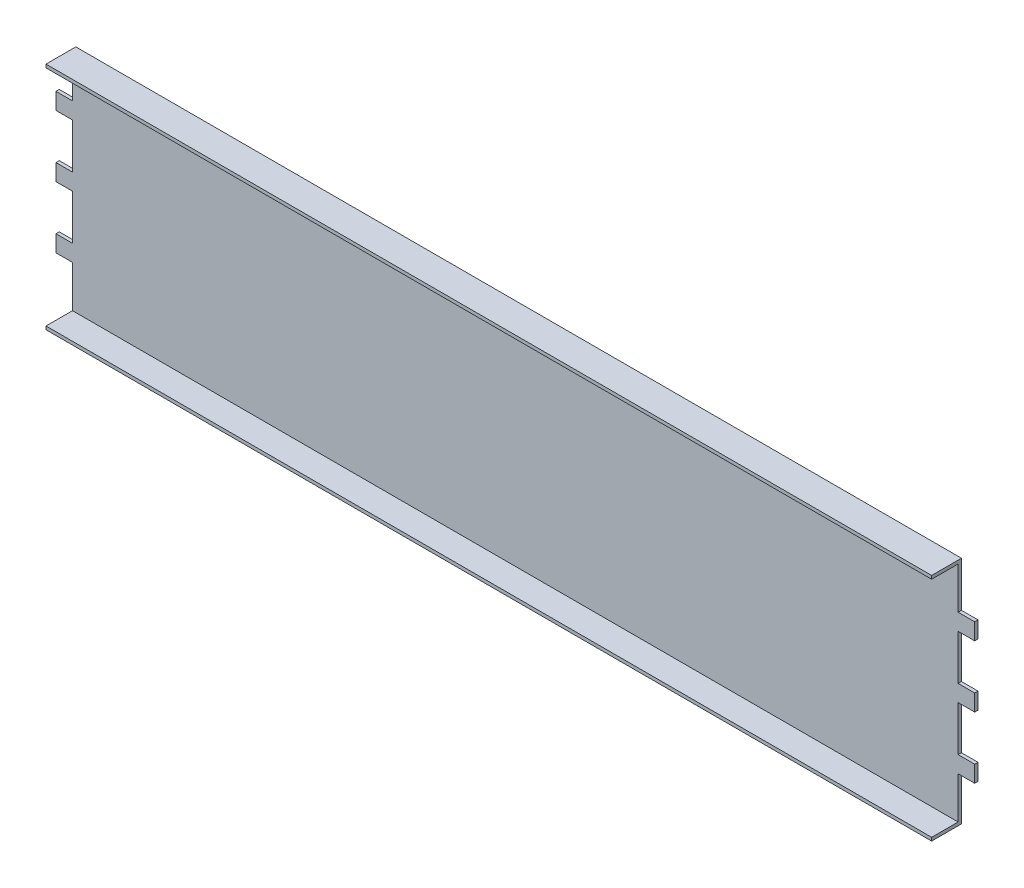
ISO-10303-21;
HEADER;
FILE_DESCRIPTION(('STEP AP214'),'2;1');
FILE_NAME('part.step','',(''),(''),'','','');
FILE_SCHEMA(('AUTOMOTIVE_DESIGN { 1 0 10303 214 1 1 1 1 }'));
ENDSEC;
DATA;
#1=APPLICATION_CONTEXT('core data for automotive mechanical design processes');
#2=APPLICATION_PROTOCOL_DEFINITION('international standard','automotive_design',2000,#1);
#3=PRODUCT_CONTEXT('',#1,'mechanical');
#4=PRODUCT('Part','Part','',(#3));
#5=PRODUCT_RELATED_PRODUCT_CATEGORY('part','',(#4));
#6=PRODUCT_DEFINITION_FORMATION('','',#4);
#7=PRODUCT_DEFINITION_CONTEXT('part definition',#1,'design');
#8=PRODUCT_DEFINITION('design','',#6,#7);
#9=PRODUCT_DEFINITION_SHAPE('','',#8);
#10=(LENGTH_UNIT() NAMED_UNIT(*) SI_UNIT(.MILLI.,.METRE.));
#11=(NAMED_UNIT(*) PLANE_ANGLE_UNIT() SI_UNIT($,.RADIAN.));
#12=(NAMED_UNIT(*) SI_UNIT($,.STERADIAN.) SOLID_ANGLE_UNIT());
#13=UNCERTAINTY_MEASURE_WITH_UNIT(LENGTH_MEASURE(1.E-05),#10,'distance_accuracy_value','');
#14=(GEOMETRIC_REPRESENTATION_CONTEXT(3) GLOBAL_UNCERTAINTY_ASSIGNED_CONTEXT((#13)) GLOBAL_UNIT_ASSIGNED_CONTEXT((#10,
#11,#12)) REPRESENTATION_CONTEXT('',''));
#15=CARTESIAN_POINT('',(0.,0.,0.));
#16=DIRECTION('',(0.,0.,1.));
#17=DIRECTION('',(1.,0.,0.));
#18=AXIS2_PLACEMENT_3D('',#15,#16,#17);
#19=CARTESIAN_POINT('',(90.5,81.5000000000001,0.));
#20=DIRECTION('',(1.,0.,0.));
#21=DIRECTION('',(0.,1.,0.));
#22=AXIS2_PLACEMENT_3D('',#19,#20,#21);
#23=PLANE('',#22);
#24=DIRECTION('',(0.,-1.,0.));
#25=VECTOR('',#24,1.);
#26=CARTESIAN_POINT('',(90.4999999999999,-1.02295014862437E-13,-8.00000000000001));
#27=LINE('',#26,#25);
#28=CARTESIAN_POINT('',(90.5000000000009,914.375000000002,-8.00000000000001));
#29=VERTEX_POINT('',#28);
#30=CARTESIAN_POINT('',(90.5000000000009,900.750000000002,-7.99999999999981));
#31=VERTEX_POINT('',#30);
#32=EDGE_CURVE('E426',#29,#31,#27,.T.);
#33=ORIENTED_EDGE('',*,*,#32,.F.);
#34=DIRECTION('',(0.,0.,-1.));
#35=VECTOR('',#34,1.);
#36=CARTESIAN_POINT('',(90.5000000000009,914.375000000002,-7.99999999999981));
#37=LINE('',#36,#35);
#38=CARTESIAN_POINT('',(90.5000000000009,914.375000000002,-9.00000000000001));
#39=VERTEX_POINT('',#38);
#40=EDGE_CURVE('E245',#29,#39,#37,.T.);
#41=ORIENTED_EDGE('',*,*,#40,.T.);
#42=DIRECTION('',(0.,-1.,0.));
#43=VECTOR('',#42,1.);
#44=CARTESIAN_POINT('',(90.4999999999999,-1.02295014862437E-13,-9.00000000000001));
#45=LINE('',#44,#43);
#46=CARTESIAN_POINT('',(90.5000000000009,900.750000000002,-9.00000000000001));
#47=VERTEX_POINT('',#46);
#48=EDGE_CURVE('E456',#39,#47,#45,.T.);
#49=ORIENTED_EDGE('',*,*,#48,.T.);
#50=DIRECTION('',(0.,0.,-1.));
#51=VECTOR('',#50,1.);
#52=CARTESIAN_POINT('',(90.5000000000009,900.750000000002,-7.99999999999981));
#53=LINE('',#52,#51);
#54=EDGE_CURVE('E281',#31,#47,#53,.T.);
#55=ORIENTED_EDGE('',*,*,#54,.F.);
#56=EDGE_LOOP('',(#33,#41,#49,#55));
#57=FACE_BOUND('',#56,.T.);
#58=ADVANCED_FACE('F16',(#57),#23,.F.);
#59=CARTESIAN_POINT('',(90.5000000000009,895.750000000002,-8.00000000000001));
#60=VERTEX_POINT('',#59);
#61=CARTESIAN_POINT('',(90.5000000000009,882.125000000002,-7.99999999999981));
#62=VERTEX_POINT('',#61);
#63=EDGE_CURVE('E507',#60,#62,#27,.T.);
#64=ORIENTED_EDGE('',*,*,#63,.F.);
#65=DIRECTION('',(0.,0.,-1.));
#66=VECTOR('',#65,1.);
#67=CARTESIAN_POINT('',(90.5000000000009,895.750000000002,-7.99999999999981));
#68=LINE('',#67,#66);
#69=CARTESIAN_POINT('',(90.5000000000009,895.750000000002,-9.00000000000001));
#70=VERTEX_POINT('',#69);
#71=EDGE_CURVE('E277',#60,#70,#68,.T.);
#72=ORIENTED_EDGE('',*,*,#71,.T.);
#73=CARTESIAN_POINT('',(90.5000000000009,882.125000000002,-9.00000000000001));
#74=VERTEX_POINT('',#73);
#75=EDGE_CURVE('E543',#70,#74,#45,.T.);
#76=ORIENTED_EDGE('',*,*,#75,.T.);
#77=DIRECTION('',(0.,0.,-1.));
#78=VECTOR('',#77,1.);
#79=CARTESIAN_POINT('',(90.5000000000009,882.125000000002,-7.99999999999981));
#80=LINE('',#79,#78);
#81=EDGE_CURVE('E309',#62,#74,#80,.T.);
#82=ORIENTED_EDGE('',*,*,#81,.F.);
#83=EDGE_LOOP('',(#64,#72,#76,#82));
#84=FACE_BOUND('',#83,.T.);
#85=ADVANCED_FACE('F547',(#84),#23,.F.);
#86=CARTESIAN_POINT('',(90.5000000000009,933.000000000002,-8.99999999999988));
#87=VERTEX_POINT('',#86);
#88=CARTESIAN_POINT('',(90.5000000000009,919.375000000002,-9.00000000000001));
#89=VERTEX_POINT('',#88);
#90=EDGE_CURVE('E436',#87,#89,#45,.T.);
#91=ORIENTED_EDGE('',*,*,#90,.T.);
#92=DIRECTION('',(0.,0.,-1.));
#93=VECTOR('',#92,1.);
#94=CARTESIAN_POINT('',(90.5000000000009,919.375000000002,-7.99999999999981));
#95=LINE('',#94,#93);
#96=CARTESIAN_POINT('',(90.5000000000009,919.375000000002,-7.99999999999981));
#97=VERTEX_POINT('',#96);
#98=EDGE_CURVE('E258',#97,#89,#95,.T.);
#99=ORIENTED_EDGE('',*,*,#98,.F.);
#100=CARTESIAN_POINT('',(90.5000000000009,932.000000000002,-7.99999999999981));
#101=VERTEX_POINT('',#100);
#102=EDGE_CURVE('E424',#101,#97,#27,.T.);
#103=ORIENTED_EDGE('',*,*,#102,.F.);
#104=DIRECTION('',(0.,0.,1.));
#105=VECTOR('',#104,1.);
#106=CARTESIAN_POINT('',(90.5000000000009,932.000000000002,-9.00000000000001));
#107=LINE('',#106,#105);
#108=CARTESIAN_POINT('',(90.5000000000009,932.000000000002,0.));
#109=VERTEX_POINT('',#108);
#110=EDGE_CURVE('E419',#101,#109,#107,.T.);
#111=ORIENTED_EDGE('',*,*,#110,.T.);
#112=DIRECTION('',(0.,-1.,0.));
#113=VECTOR('',#112,1.);
#114=CARTESIAN_POINT('',(90.5000000000009,863.500000000002,2.18575157973073E-13));
#115=LINE('',#114,#113);
#116=CARTESIAN_POINT('',(90.5000000000009,933.,0.));
#117=VERTEX_POINT('',#116);
#118=EDGE_CURVE('E430',#117,#109,#115,.T.);
#119=ORIENTED_EDGE('',*,*,#118,.F.);
#120=DIRECTION('',(0.,0.,1.));
#121=VECTOR('',#120,1.);
#122=CARTESIAN_POINT('',(90.5000000000009,933.000000000002,-9.00000000000001));
#123=LINE('',#122,#121);
#124=EDGE_CURVE('E396',#87,#117,#123,.T.);
#125=ORIENTED_EDGE('',*,*,#124,.F.);
#126=EDGE_LOOP('',(#91,#99,#103,#111,#119,#125));
#127=FACE_BOUND('',#126,.T.);
#128=ADVANCED_FACE('F498',(#127),#23,.F.);
#129=CARTESIAN_POINT('',(358.000000000002,863.500000000001,2.18575157973071E-13));
#130=DIRECTION('',(-1.,0.,0.));
#131=DIRECTION('',(0.,-1.,0.));
#132=AXIS2_PLACEMENT_3D('',#129,#130,#131);
#133=PLANE('',#132);
#134=DIRECTION('',(0.,1.,0.));
#135=VECTOR('',#134,1.);
#136=CARTESIAN_POINT('',(358.000000000003,4.17332834956603E-13,-8.00000000000001));
#137=LINE('',#136,#135);
#138=CARTESIAN_POINT('',(358.000000000001,882.125000000002,-8.00000000000001));
#139=VERTEX_POINT('',#138);
#140=CARTESIAN_POINT('',(358.000000000001,895.750000000002,-7.99999999999981));
#141=VERTEX_POINT('',#140);
#142=EDGE_CURVE('E422',#139,#141,#137,.T.);
#143=ORIENTED_EDGE('',*,*,#142,.F.);
#144=DIRECTION('',(0.,0.,-1.));
#145=VECTOR('',#144,1.);
#146=CARTESIAN_POINT('',(358.000000000001,882.125000000002,-7.99999999999981));
#147=LINE('',#146,#145);
#148=CARTESIAN_POINT('',(358.000000000001,882.125000000002,-9.00000000000001));
#149=VERTEX_POINT('',#148);
#150=EDGE_CURVE('E332',#139,#149,#147,.T.);
#151=ORIENTED_EDGE('',*,*,#150,.T.);
#152=DIRECTION('',(0.,1.,0.));
#153=VECTOR('',#152,1.);
#154=CARTESIAN_POINT('',(358.000000000003,4.17332834956603E-13,-9.00000000000001));
#155=LINE('',#154,#153);
#156=CARTESIAN_POINT('',(358.000000000001,895.750000000002,-9.00000000000001));
#157=VERTEX_POINT('',#156);
#158=EDGE_CURVE('E440',#149,#157,#155,.T.);
#159=ORIENTED_EDGE('',*,*,#158,.T.);
#160=DIRECTION('',(0.,0.,-1.));
#161=VECTOR('',#160,1.);
#162=CARTESIAN_POINT('',(358.000000000001,895.750000000002,-7.99999999999981));
#163=LINE('',#162,#161);
#164=EDGE_CURVE('E363',#141,#157,#163,.T.);
#165=ORIENTED_EDGE('',*,*,#164,.F.);
#166=EDGE_LOOP('',(#143,#151,#159,#165));
#167=FACE_BOUND('',#166,.T.);
#168=ADVANCED_FACE('F473',(#167),#133,.F.);
#169=CARTESIAN_POINT('',(358.000000000001,900.750000000002,-8.00000000000001));
#170=VERTEX_POINT('',#169);
#171=CARTESIAN_POINT('',(358.000000000001,914.375000000002,-7.99999999999981));
#172=VERTEX_POINT('',#171);
#173=EDGE_CURVE('E487',#170,#172,#137,.T.);
#174=ORIENTED_EDGE('',*,*,#173,.F.);
#175=DIRECTION('',(0.,0.,-1.));
#176=VECTOR('',#175,1.);
#177=CARTESIAN_POINT('',(358.000000000001,900.750000000002,-7.99999999999981));
#178=LINE('',#177,#176);
#179=CARTESIAN_POINT('',(358.000000000001,900.750000000002,-9.00000000000001));
#180=VERTEX_POINT('',#179);
#181=EDGE_CURVE('E359',#170,#180,#178,.T.);
#182=ORIENTED_EDGE('',*,*,#181,.T.);
#183=CARTESIAN_POINT('',(358.000000000001,914.375000000002,-9.00000000000001));
#184=VERTEX_POINT('',#183);
#185=EDGE_CURVE('E462',#180,#184,#155,.T.);
#186=ORIENTED_EDGE('',*,*,#185,.T.);
#187=DIRECTION('',(0.,0.,-1.));
#188=VECTOR('',#187,1.);
#189=CARTESIAN_POINT('',(358.000000000001,914.375000000002,-7.99999999999981));
#190=LINE('',#189,#188);
#191=EDGE_CURVE('E390',#172,#184,#190,.T.);
#192=ORIENTED_EDGE('',*,*,#191,.F.);
#193=EDGE_LOOP('',(#174,#182,#186,#192));
#194=FACE_BOUND('',#193,.T.);
#195=ADVANCED_FACE('F581',(#194),#133,.F.);
#196=CARTESIAN_POINT('',(358.000000000001,863.500000000002,-8.99999999999985));
#197=VERTEX_POINT('',#196);
#198=CARTESIAN_POINT('',(358.000000000001,877.125000000002,-9.00000000000001));
#199=VERTEX_POINT('',#198);
#200=EDGE_CURVE('E437',#197,#199,#155,.T.);
#201=ORIENTED_EDGE('',*,*,#200,.T.);
#202=DIRECTION('',(0.,0.,-1.));
#203=VECTOR('',#202,1.);
#204=CARTESIAN_POINT('',(358.000000000001,877.125000000002,-7.99999999999981));
#205=LINE('',#204,#203);
#206=CARTESIAN_POINT('',(358.000000000001,877.125000000002,-7.99999999999981));
#207=VERTEX_POINT('',#206);
#208=EDGE_CURVE('E336',#207,#199,#205,.T.);
#209=ORIENTED_EDGE('',*,*,#208,.F.);
#210=CARTESIAN_POINT('',(358.000000000002,864.5,-7.9999999999999));
#211=VERTEX_POINT('',#210);
#212=EDGE_CURVE('E399',#211,#207,#137,.T.);
#213=ORIENTED_EDGE('',*,*,#212,.F.);
#214=DIRECTION('',(0.,0.,-1.));
#215=VECTOR('',#214,1.);
#216=CARTESIAN_POINT('',(358.000000000002,864.5,-840.081223467358));
#217=LINE('',#216,#215);
#218=CARTESIAN_POINT('',(358.000000000002,864.5,0.));
#219=VERTEX_POINT('',#218);
#220=EDGE_CURVE('E402',#219,#211,#217,.T.);
#221=ORIENTED_EDGE('',*,*,#220,.F.);
#222=DIRECTION('',(0.,1.,0.));
#223=VECTOR('',#222,1.);
#224=CARTESIAN_POINT('',(358.000000000002,863.500000000001,2.18575157973071E-13));
#225=LINE('',#224,#223);
#226=CARTESIAN_POINT('',(358.000000000002,863.500000000001,2.18575157973071E-13));
#227=VERTEX_POINT('',#226);
#228=EDGE_CURVE('E432',#227,#219,#225,.T.);
#229=ORIENTED_EDGE('',*,*,#228,.F.);
#230=DIRECTION('',(0.,0.,1.));
#231=VECTOR('',#230,1.);
#232=CARTESIAN_POINT('',(358.000000000001,863.500000000002,-7.99999999999959));
#233=LINE('',#232,#231);
#234=EDGE_CURVE('E410',#197,#227,#233,.T.);
#235=ORIENTED_EDGE('',*,*,#234,.F.);
#236=EDGE_LOOP('',(#201,#209,#213,#221,#229,#235));
#237=FACE_BOUND('',#236,.T.);
#238=ADVANCED_FACE('F527',(#237),#133,.F.);
#239=CARTESIAN_POINT('',(90.5000000000009,877.125000000002,-7.99999999999981));
#240=VERTEX_POINT('',#239);
#241=CARTESIAN_POINT('',(90.5000000000009,864.500000000001,-7.9999999999999));
#242=VERTEX_POINT('',#241);
#243=EDGE_CURVE('E427',#240,#242,#27,.T.);
#244=ORIENTED_EDGE('',*,*,#243,.F.);
#245=DIRECTION('',(0.,0.,-1.));
#246=VECTOR('',#245,1.);
#247=CARTESIAN_POINT('',(90.5000000000009,877.125000000002,-7.99999999999981));
#248=LINE('',#247,#246);
#249=CARTESIAN_POINT('',(90.5000000000009,877.125000000002,-9.00000000000001));
#250=VERTEX_POINT('',#249);
#251=EDGE_CURVE('E305',#240,#250,#248,.T.);
#252=ORIENTED_EDGE('',*,*,#251,.T.);
#253=CARTESIAN_POINT('',(90.5000000000009,863.500000000002,-8.9999999999997));
#254=VERTEX_POINT('',#253);
#255=EDGE_CURVE('E439',#250,#254,#45,.T.);
#256=ORIENTED_EDGE('',*,*,#255,.T.);
#257=DIRECTION('',(0.,0.,1.));
#258=VECTOR('',#257,1.);
#259=CARTESIAN_POINT('',(90.5000000000014,863.500000000002,-7.99999999999962));
#260=LINE('',#259,#258);
#261=CARTESIAN_POINT('',(90.5,863.500000000002,0.));
#262=VERTEX_POINT('',#261);
#263=EDGE_CURVE('E20',#254,#262,#260,.T.);
#264=ORIENTED_EDGE('',*,*,#263,.T.);
#265=DIRECTION('',(0.,-1.,0.));
#266=VECTOR('',#265,1.);
#267=CARTESIAN_POINT('',(90.5000000000009,863.500000000002,2.18575157973073E-13));
#268=LINE('',#267,#266);
#269=CARTESIAN_POINT('',(90.5000000000009,864.5,0.));
#270=VERTEX_POINT('',#269);
#271=EDGE_CURVE('E434',#270,#262,#268,.T.);
#272=ORIENTED_EDGE('',*,*,#271,.F.);
#273=DIRECTION('',(0.,0.,1.));
#274=VECTOR('',#273,1.);
#275=CARTESIAN_POINT('',(90.5000000000009,864.500000000001,-840.081223467358));
#276=LINE('',#275,#274);
#277=EDGE_CURVE('E400',#242,#270,#276,.T.);
#278=ORIENTED_EDGE('',*,*,#277,.F.);
#279=EDGE_LOOP('',(#244,#252,#256,#264,#272,#278));
#280=FACE_BOUND('',#279,.T.);
#281=ADVANCED_FACE('F517',(#280),#23,.F.);
#282=CARTESIAN_POINT('',(358.000000000001,919.375000000002,-7.99999999999981));
#283=VERTEX_POINT('',#282);
#284=CARTESIAN_POINT('',(358.000000000001,932.000000000002,-7.99999999999981));
#285=VERTEX_POINT('',#284);
#286=EDGE_CURVE('E423',#283,#285,#137,.T.);
#287=ORIENTED_EDGE('',*,*,#286,.F.);
#288=DIRECTION('',(0.,0.,-1.));
#289=VECTOR('',#288,1.);
#290=CARTESIAN_POINT('',(358.000000000001,919.375000000002,-7.99999999999981));
#291=LINE('',#290,#289);
#292=CARTESIAN_POINT('',(358.000000000001,919.375000000002,-9.00000000000001));
#293=VERTEX_POINT('',#292);
#294=EDGE_CURVE('E387',#283,#293,#291,.T.);
#295=ORIENTED_EDGE('',*,*,#294,.T.);
#296=CARTESIAN_POINT('',(358.000000000001,933.000000000002,-8.99999999999988));
#297=VERTEX_POINT('',#296);
#298=EDGE_CURVE('E441',#293,#297,#155,.T.);
#299=ORIENTED_EDGE('',*,*,#298,.T.);
#300=DIRECTION('',(0.,0.,-1.));
#301=VECTOR('',#300,1.);
#302=CARTESIAN_POINT('',(358.000000000001,933.000000000002,-9.00000000000001));
#303=LINE('',#302,#301);
#304=CARTESIAN_POINT('',(358.000000000001,933.,0.));
#305=VERTEX_POINT('',#304);
#306=EDGE_CURVE('E398',#305,#297,#303,.T.);
#307=ORIENTED_EDGE('',*,*,#306,.F.);
#308=DIRECTION('',(0.,1.,0.));
#309=VECTOR('',#308,1.);
#310=CARTESIAN_POINT('',(358.000000000002,863.500000000001,2.18575157973071E-13));
#311=LINE('',#310,#309);
#312=CARTESIAN_POINT('',(358.000000000001,932.000000000002,0.));
#313=VERTEX_POINT('',#312);
#314=EDGE_CURVE('E428',#313,#305,#311,.T.);
#315=ORIENTED_EDGE('',*,*,#314,.F.);
#316=DIRECTION('',(0.,0.,-1.));
#317=VECTOR('',#316,1.);
#318=CARTESIAN_POINT('',(358.000000000001,932.000000000002,-9.00000000000001));
#319=LINE('',#318,#317);
#320=EDGE_CURVE('E416',#313,#285,#319,.T.);
#321=ORIENTED_EDGE('',*,*,#320,.T.);
#322=EDGE_LOOP('',(#287,#295,#299,#307,#315,#321));
#323=FACE_BOUND('',#322,.T.);
#324=ADVANCED_FACE('F494',(#323),#133,.F.);
#325=CARTESIAN_POINT('',(358.000000000002,863.500000000001,2.18575157973071E-13));
#326=DIRECTION('',(0.,0.,-1.));
#327=DIRECTION('',(0.,1.,0.));
#328=AXIS2_PLACEMENT_3D('',#325,#326,#327);
#329=PLANE('',#328);
#330=DIRECTION('',(1.,0.,0.));
#331=VECTOR('',#330,1.);
#332=CARTESIAN_POINT('',(0.,933.,0.));
#333=LINE('',#332,#331);
#334=EDGE_CURVE('E450',#305,#117,#333,.F.);
#335=ORIENTED_EDGE('',*,*,#334,.T.);
#336=ORIENTED_EDGE('',*,*,#118,.T.);
#337=DIRECTION('',(1.,0.,0.));
#338=VECTOR('',#337,1.);
#339=CARTESIAN_POINT('',(0.,932.000000000002,0.));
#340=LINE('',#339,#338);
#341=EDGE_CURVE('E447',#109,#313,#340,.T.);
#342=ORIENTED_EDGE('',*,*,#341,.T.);
#343=ORIENTED_EDGE('',*,*,#314,.T.);
#344=EDGE_LOOP('',(#335,#336,#342,#343));
#345=FACE_BOUND('',#344,.T.);
#346=ADVANCED_FACE('F580',(#345),#329,.F.);
#347=CARTESIAN_POINT('',(0.,0.,-9.00000000000001));
#348=DIRECTION('',(0.,0.,-1.));
#349=DIRECTION('',(0.,1.,0.));
#350=AXIS2_PLACEMENT_3D('',#347,#348,#349);
#351=PLANE('',#350);
#352=ORIENTED_EDGE('',*,*,#90,.F.);
#353=DIRECTION('',(1.,0.,0.));
#354=VECTOR('',#353,1.);
#355=CARTESIAN_POINT('',(437.500000000002,933.000000000002,-8.99999999999988));
#356=LINE('',#355,#354);
#357=EDGE_CURVE('E11',#87,#297,#356,.T.);
#358=ORIENTED_EDGE('',*,*,#357,.T.);
#359=ORIENTED_EDGE('',*,*,#298,.F.);
#360=DIRECTION('',(1.,0.,0.));
#361=VECTOR('',#360,1.);
#362=CARTESIAN_POINT('',(358.000000000001,919.375000000002,-9.00000000000001));
#363=LINE('',#362,#361);
#364=CARTESIAN_POINT('',(363.000000000001,919.375000000002,-9.00000000000001));
#365=VERTEX_POINT('',#364);
#366=EDGE_CURVE('E362',#293,#365,#363,.T.);
#367=ORIENTED_EDGE('',*,*,#366,.T.);
#368=DIRECTION('',(0.,-1.,0.));
#369=VECTOR('',#368,1.);
#370=CARTESIAN_POINT('',(363.000000000001,919.375000000002,-9.00000000000001));
#371=LINE('',#370,#369);
#372=CARTESIAN_POINT('',(363.000000000001,914.375000000002,-9.00000000000001));
#373=VERTEX_POINT('',#372);
#374=EDGE_CURVE('E382',#365,#373,#371,.T.);
#375=ORIENTED_EDGE('',*,*,#374,.T.);
#376=DIRECTION('',(-1.,0.,0.));
#377=VECTOR('',#376,1.);
#378=CARTESIAN_POINT('',(358.000000000001,914.375000000002,-9.00000000000001));
#379=LINE('',#378,#377);
#380=EDGE_CURVE('E373',#373,#184,#379,.T.);
#381=ORIENTED_EDGE('',*,*,#380,.T.);
#382=ORIENTED_EDGE('',*,*,#185,.F.);
#383=DIRECTION('',(1.,0.,0.));
#384=VECTOR('',#383,1.);
#385=CARTESIAN_POINT('',(358.000000000001,900.750000000002,-9.00000000000001));
#386=LINE('',#385,#384);
#387=CARTESIAN_POINT('',(363.000000000001,900.750000000002,-9.00000000000001));
#388=VERTEX_POINT('',#387);
#389=EDGE_CURVE('E335',#180,#388,#386,.T.);
#390=ORIENTED_EDGE('',*,*,#389,.T.);
#391=DIRECTION('',(0.,-1.,0.));
#392=VECTOR('',#391,1.);
#393=CARTESIAN_POINT('',(363.000000000001,900.750000000002,-9.00000000000001));
#394=LINE('',#393,#392);
#395=CARTESIAN_POINT('',(363.000000000001,895.750000000002,-9.00000000000001));
#396=VERTEX_POINT('',#395);
#397=EDGE_CURVE('E354',#388,#396,#394,.T.);
#398=ORIENTED_EDGE('',*,*,#397,.T.);
#399=DIRECTION('',(-1.,0.,0.));
#400=VECTOR('',#399,1.);
#401=CARTESIAN_POINT('',(358.000000000001,895.750000000002,-9.00000000000001));
#402=LINE('',#401,#400);
#403=EDGE_CURVE('E345',#396,#157,#402,.T.);
#404=ORIENTED_EDGE('',*,*,#403,.T.);
#405=ORIENTED_EDGE('',*,*,#158,.F.);
#406=DIRECTION('',(1.,0.,0.));
#407=VECTOR('',#406,1.);
#408=CARTESIAN_POINT('',(358.000000000001,882.125000000002,-9.00000000000001));
#409=LINE('',#408,#407);
#410=CARTESIAN_POINT('',(363.000000000001,882.125000000002,-9.00000000000001));
#411=VERTEX_POINT('',#410);
#412=EDGE_CURVE('E308',#149,#411,#409,.T.);
#413=ORIENTED_EDGE('',*,*,#412,.T.);
#414=DIRECTION('',(0.,-1.,0.));
#415=VECTOR('',#414,1.);
#416=CARTESIAN_POINT('',(363.000000000001,882.125000000002,-9.00000000000001));
#417=LINE('',#416,#415);
#418=CARTESIAN_POINT('',(363.000000000001,877.125000000002,-9.00000000000001));
#419=VERTEX_POINT('',#418);
#420=EDGE_CURVE('E327',#411,#419,#417,.T.);
#421=ORIENTED_EDGE('',*,*,#420,.T.);
#422=DIRECTION('',(-1.,0.,0.));
#423=VECTOR('',#422,1.);
#424=CARTESIAN_POINT('',(358.000000000001,877.125000000002,-9.00000000000001));
#425=LINE('',#424,#423);
#426=EDGE_CURVE('E319',#419,#199,#425,.T.);
#427=ORIENTED_EDGE('',*,*,#426,.T.);
#428=ORIENTED_EDGE('',*,*,#200,.F.);
#429=DIRECTION('',(-1.,0.,0.));
#430=VECTOR('',#429,1.);
#431=CARTESIAN_POINT('',(90.0000000000015,863.500000000002,-8.9999999999997));
#432=LINE('',#431,#430);
#433=EDGE_CURVE('E25',#197,#254,#432,.T.);
#434=ORIENTED_EDGE('',*,*,#433,.T.);
#435=ORIENTED_EDGE('',*,*,#255,.F.);
#436=DIRECTION('',(-1.,0.,0.));
#437=VECTOR('',#436,1.);
#438=CARTESIAN_POINT('',(90.5000000000009,877.125000000002,-9.00000000000001));
#439=LINE('',#438,#437);
#440=CARTESIAN_POINT('',(85.5000000000009,877.125000000002,-9.00000000000001));
#441=VERTEX_POINT('',#440);
#442=EDGE_CURVE('E280',#250,#441,#439,.T.);
#443=ORIENTED_EDGE('',*,*,#442,.T.);
#444=DIRECTION('',(0.,1.,0.));
#445=VECTOR('',#444,1.);
#446=CARTESIAN_POINT('',(85.5000000000009,877.125000000002,-9.00000000000001));
#447=LINE('',#446,#445);
#448=CARTESIAN_POINT('',(85.5000000000009,882.125000000002,-9.00000000000001));
#449=VERTEX_POINT('',#448);
#450=EDGE_CURVE('E300',#441,#449,#447,.T.);
#451=ORIENTED_EDGE('',*,*,#450,.T.);
#452=DIRECTION('',(1.,0.,0.));
#453=VECTOR('',#452,1.);
#454=CARTESIAN_POINT('',(90.5000000000009,882.125000000002,-9.00000000000001));
#455=LINE('',#454,#453);
#456=EDGE_CURVE('E291',#449,#74,#455,.T.);
#457=ORIENTED_EDGE('',*,*,#456,.T.);
#458=ORIENTED_EDGE('',*,*,#75,.F.);
#459=DIRECTION('',(-1.,0.,0.));
#460=VECTOR('',#459,1.);
#461=CARTESIAN_POINT('',(90.5000000000009,895.750000000002,-9.00000000000001));
#462=LINE('',#461,#460);
#463=CARTESIAN_POINT('',(85.5000000000009,895.750000000002,-9.00000000000001));
#464=VERTEX_POINT('',#463);
#465=EDGE_CURVE('E257',#70,#464,#462,.T.);
#466=ORIENTED_EDGE('',*,*,#465,.T.);
#467=DIRECTION('',(0.,1.,0.));
#468=VECTOR('',#467,1.);
#469=CARTESIAN_POINT('',(85.5000000000009,895.750000000002,-9.00000000000001));
#470=LINE('',#469,#468);
#471=CARTESIAN_POINT('',(85.5000000000009,900.750000000002,-9.00000000000001));
#472=VERTEX_POINT('',#471);
#473=EDGE_CURVE('E272',#464,#472,#470,.T.);
#474=ORIENTED_EDGE('',*,*,#473,.T.);
#475=DIRECTION('',(1.,0.,0.));
#476=VECTOR('',#475,1.);
#477=CARTESIAN_POINT('',(90.5000000000009,900.750000000002,-9.00000000000001));
#478=LINE('',#477,#476);
#479=EDGE_CURVE('E263',#472,#47,#478,.T.);
#480=ORIENTED_EDGE('',*,*,#479,.T.);
#481=ORIENTED_EDGE('',*,*,#48,.F.);
#482=DIRECTION('',(-1.,0.,0.));
#483=VECTOR('',#482,1.);
#484=CARTESIAN_POINT('',(90.5000000000009,914.375000000002,-9.00000000000001));
#485=LINE('',#484,#483);
#486=CARTESIAN_POINT('',(85.5000000000009,914.375000000002,-9.00000000000001));
#487=VERTEX_POINT('',#486);
#488=EDGE_CURVE('E253',#39,#487,#485,.T.);
#489=ORIENTED_EDGE('',*,*,#488,.T.);
#490=DIRECTION('',(0.,1.,0.));
#491=VECTOR('',#490,1.);
#492=CARTESIAN_POINT('',(85.5000000000009,914.375000000002,-9.00000000000001));
#493=LINE('',#492,#491);
#494=CARTESIAN_POINT('',(85.5000000000009,919.375000000002,-9.00000000000001));
#495=VERTEX_POINT('',#494);
#496=EDGE_CURVE('E232',#487,#495,#493,.T.);
#497=ORIENTED_EDGE('',*,*,#496,.T.);
#498=DIRECTION('',(1.,0.,0.));
#499=VECTOR('',#498,1.);
#500=CARTESIAN_POINT('',(90.5000000000009,919.375000000002,-9.00000000000001));
#501=LINE('',#500,#499);
#502=EDGE_CURVE('E247',#495,#89,#501,.T.);
#503=ORIENTED_EDGE('',*,*,#502,.T.);
#504=EDGE_LOOP('',(#352,#358,#359,#367,#375,#381,#382,#390,#398,#404,#405,#413,#421,#427,#428,
#434,#435,#443,#451,#457,#458,#466,#474,#480,#481,#489,#497,#503));
#505=FACE_BOUND('',#504,.T.);
#506=ADVANCED_FACE('F481',(#505),#351,.T.);
#507=CARTESIAN_POINT('',(437.500000000002,933.000000000002,-9.00000000000001));
#508=DIRECTION('',(0.,-1.,0.));
#509=DIRECTION('',(1.,0.,0.));
#510=AXIS2_PLACEMENT_3D('',#507,#508,#509);
#511=PLANE('',#510);
#512=ORIENTED_EDGE('',*,*,#357,.F.);
#513=ORIENTED_EDGE('',*,*,#124,.T.);
#514=ORIENTED_EDGE('',*,*,#334,.F.);
#515=ORIENTED_EDGE('',*,*,#306,.T.);
#516=EDGE_LOOP('',(#512,#513,#514,#515));
#517=FACE_BOUND('',#516,.T.);
#518=ADVANCED_FACE('F594',(#517),#511,.F.);
#519=DIRECTION('',(1.,0.,0.));
#520=VECTOR('',#519,1.);
#521=CARTESIAN_POINT('',(0.,864.5,0.));
#522=LINE('',#521,#520);
#523=EDGE_CURVE('E406',#219,#270,#522,.F.);
#524=ORIENTED_EDGE('',*,*,#523,.T.);
#525=ORIENTED_EDGE('',*,*,#271,.T.);
#526=DIRECTION('',(1.,0.,0.));
#527=VECTOR('',#526,1.);
#528=CARTESIAN_POINT('',(0.,863.500000000001,0.));
#529=LINE('',#528,#527);
#530=EDGE_CURVE('E403',#262,#227,#529,.T.);
#531=ORIENTED_EDGE('',*,*,#530,.T.);
#532=ORIENTED_EDGE('',*,*,#228,.T.);
#533=EDGE_LOOP('',(#524,#525,#531,#532));
#534=FACE_BOUND('',#533,.T.);
#535=ADVANCED_FACE('F18',(#534),#329,.F.);
#536=CARTESIAN_POINT('',(0.,0.,-8.00000000000001));
#537=DIRECTION('',(0.,0.,-1.));
#538=DIRECTION('',(0.,1.,0.));
#539=AXIS2_PLACEMENT_3D('',#536,#537,#538);
#540=PLANE('',#539);
#541=DIRECTION('',(1.,0.,0.));
#542=VECTOR('',#541,1.);
#543=CARTESIAN_POINT('',(437.500000000002,932.000000000002,-7.99999999999981));
#544=LINE('',#543,#542);
#545=EDGE_CURVE('E412',#101,#285,#544,.T.);
#546=ORIENTED_EDGE('',*,*,#545,.F.);
#547=ORIENTED_EDGE('',*,*,#102,.T.);
#548=DIRECTION('',(1.,0.,0.));
#549=VECTOR('',#548,1.);
#550=CARTESIAN_POINT('',(90.5000000000009,919.375000000002,-7.99999999999981));
#551=LINE('',#550,#549);
#552=CARTESIAN_POINT('',(85.5000000000009,919.375000000002,-7.99999999999981));
#553=VERTEX_POINT('',#552);
#554=EDGE_CURVE('E236',#553,#97,#551,.T.);
#555=ORIENTED_EDGE('',*,*,#554,.F.);
#556=DIRECTION('',(0.,1.,0.));
#557=VECTOR('',#556,1.);
#558=CARTESIAN_POINT('',(85.5000000000009,914.375000000002,-7.99999999999981));
#559=LINE('',#558,#557);
#560=CARTESIAN_POINT('',(85.5000000000009,914.375000000002,-7.99999999999981));
#561=VERTEX_POINT('',#560);
#562=EDGE_CURVE('E230',#561,#553,#559,.T.);
#563=ORIENTED_EDGE('',*,*,#562,.F.);
#564=DIRECTION('',(-1.,0.,0.));
#565=VECTOR('',#564,1.);
#566=CARTESIAN_POINT('',(90.5000000000009,914.375000000002,-7.99999999999981));
#567=LINE('',#566,#565);
#568=EDGE_CURVE('E33',#29,#561,#567,.T.);
#569=ORIENTED_EDGE('',*,*,#568,.F.);
#570=ORIENTED_EDGE('',*,*,#32,.T.);
#571=DIRECTION('',(1.,0.,0.));
#572=VECTOR('',#571,1.);
#573=CARTESIAN_POINT('',(90.5000000000009,900.750000000002,-7.99999999999981));
#574=LINE('',#573,#572);
#575=CARTESIAN_POINT('',(85.5000000000009,900.750000000002,-7.99999999999981));
#576=VERTEX_POINT('',#575);
#577=EDGE_CURVE('E266',#576,#31,#574,.T.);
#578=ORIENTED_EDGE('',*,*,#577,.F.);
#579=DIRECTION('',(0.,1.,0.));
#580=VECTOR('',#579,1.);
#581=CARTESIAN_POINT('',(85.5000000000009,895.750000000002,-7.99999999999981));
#582=LINE('',#581,#580);
#583=CARTESIAN_POINT('',(85.5000000000009,895.750000000002,-7.99999999999981));
#584=VERTEX_POINT('',#583);
#585=EDGE_CURVE('E262',#584,#576,#582,.T.);
#586=ORIENTED_EDGE('',*,*,#585,.F.);
#587=DIRECTION('',(-1.,0.,0.));
#588=VECTOR('',#587,1.);
#589=CARTESIAN_POINT('',(90.5000000000009,895.750000000002,-7.99999999999981));
#590=LINE('',#589,#588);
#591=EDGE_CURVE('E40',#60,#584,#590,.T.);
#592=ORIENTED_EDGE('',*,*,#591,.F.);
#593=ORIENTED_EDGE('',*,*,#63,.T.);
#594=DIRECTION('',(1.,0.,0.));
#595=VECTOR('',#594,1.);
#596=CARTESIAN_POINT('',(90.5000000000009,882.125000000002,-7.99999999999981));
#597=LINE('',#596,#595);
#598=CARTESIAN_POINT('',(85.5000000000009,882.125000000002,-7.99999999999981));
#599=VERTEX_POINT('',#598);
#600=EDGE_CURVE('E294',#599,#62,#597,.T.);
#601=ORIENTED_EDGE('',*,*,#600,.F.);
#602=DIRECTION('',(0.,1.,0.));
#603=VECTOR('',#602,1.);
#604=CARTESIAN_POINT('',(85.5000000000009,877.125000000002,-7.99999999999981));
#605=LINE('',#604,#603);
#606=CARTESIAN_POINT('',(85.5000000000009,877.125000000002,-7.99999999999981));
#607=VERTEX_POINT('',#606);
#608=EDGE_CURVE('E290',#607,#599,#605,.T.);
#609=ORIENTED_EDGE('',*,*,#608,.F.);
#610=DIRECTION('',(-1.,0.,0.));
#611=VECTOR('',#610,1.);
#612=CARTESIAN_POINT('',(90.5000000000009,877.125000000002,-7.99999999999981));
#613=LINE('',#612,#611);
#614=EDGE_CURVE('E287',#240,#607,#613,.T.);
#615=ORIENTED_EDGE('',*,*,#614,.F.);
#616=ORIENTED_EDGE('',*,*,#243,.T.);
#617=DIRECTION('',(1.,0.,0.));
#618=VECTOR('',#617,1.);
#619=CARTESIAN_POINT('',(358.000000000002,864.5,-7.9999999999999));
#620=LINE('',#619,#618);
#621=EDGE_CURVE('E409',#242,#211,#620,.T.);
#622=ORIENTED_EDGE('',*,*,#621,.T.);
#623=ORIENTED_EDGE('',*,*,#212,.T.);
#624=DIRECTION('',(-1.,0.,0.));
#625=VECTOR('',#624,1.);
#626=CARTESIAN_POINT('',(358.000000000001,877.125000000002,-7.99999999999981));
#627=LINE('',#626,#625);
#628=CARTESIAN_POINT('',(363.000000000001,877.125000000002,-7.99999999999981));
#629=VERTEX_POINT('',#628);
#630=EDGE_CURVE('E322',#629,#207,#627,.T.);
#631=ORIENTED_EDGE('',*,*,#630,.F.);
#632=DIRECTION('',(0.,-1.,0.));
#633=VECTOR('',#632,1.);
#634=CARTESIAN_POINT('',(363.000000000001,882.125000000002,-7.99999999999981));
#635=LINE('',#634,#633);
#636=CARTESIAN_POINT('',(363.000000000001,882.125000000002,-7.99999999999981));
#637=VERTEX_POINT('',#636);
#638=EDGE_CURVE('E318',#637,#629,#635,.T.);
#639=ORIENTED_EDGE('',*,*,#638,.F.);
#640=DIRECTION('',(1.,0.,0.));
#641=VECTOR('',#640,1.);
#642=CARTESIAN_POINT('',(358.000000000001,882.125000000002,-7.99999999999981));
#643=LINE('',#642,#641);
#644=EDGE_CURVE('E315',#139,#637,#643,.T.);
#645=ORIENTED_EDGE('',*,*,#644,.F.);
#646=ORIENTED_EDGE('',*,*,#142,.T.);
#647=DIRECTION('',(-1.,0.,0.));
#648=VECTOR('',#647,1.);
#649=CARTESIAN_POINT('',(358.000000000001,895.750000000002,-7.99999999999981));
#650=LINE('',#649,#648);
#651=CARTESIAN_POINT('',(363.000000000001,895.750000000002,-7.99999999999981));
#652=VERTEX_POINT('',#651);
#653=EDGE_CURVE('E348',#652,#141,#650,.T.);
#654=ORIENTED_EDGE('',*,*,#653,.F.);
#655=DIRECTION('',(0.,-1.,0.));
#656=VECTOR('',#655,1.);
#657=CARTESIAN_POINT('',(363.000000000001,900.750000000002,-7.99999999999981));
#658=LINE('',#657,#656);
#659=CARTESIAN_POINT('',(363.000000000001,900.750000000002,-7.99999999999981));
#660=VERTEX_POINT('',#659);
#661=EDGE_CURVE('E344',#660,#652,#658,.T.);
#662=ORIENTED_EDGE('',*,*,#661,.F.);
#663=DIRECTION('',(1.,0.,0.));
#664=VECTOR('',#663,1.);
#665=CARTESIAN_POINT('',(358.000000000001,900.750000000002,-7.99999999999981));
#666=LINE('',#665,#664);
#667=EDGE_CURVE('E341',#170,#660,#666,.T.);
#668=ORIENTED_EDGE('',*,*,#667,.F.);
#669=ORIENTED_EDGE('',*,*,#173,.T.);
#670=DIRECTION('',(-1.,0.,0.));
#671=VECTOR('',#670,1.);
#672=CARTESIAN_POINT('',(358.000000000001,914.375000000002,-7.99999999999981));
#673=LINE('',#672,#671);
#674=CARTESIAN_POINT('',(363.000000000001,914.375000000002,-7.99999999999981));
#675=VERTEX_POINT('',#674);
#676=EDGE_CURVE('E376',#675,#172,#673,.T.);
#677=ORIENTED_EDGE('',*,*,#676,.F.);
#678=DIRECTION('',(0.,-1.,0.));
#679=VECTOR('',#678,1.);
#680=CARTESIAN_POINT('',(363.000000000001,919.375000000002,-7.99999999999981));
#681=LINE('',#680,#679);
#682=CARTESIAN_POINT('',(363.000000000001,919.375000000002,-7.99999999999981));
#683=VERTEX_POINT('',#682);
#684=EDGE_CURVE('E372',#683,#675,#681,.T.);
#685=ORIENTED_EDGE('',*,*,#684,.F.);
#686=DIRECTION('',(1.,0.,0.));
#687=VECTOR('',#686,1.);
#688=CARTESIAN_POINT('',(358.000000000001,919.375000000002,-7.99999999999981));
#689=LINE('',#688,#687);
#690=EDGE_CURVE('E369',#283,#683,#689,.T.);
#691=ORIENTED_EDGE('',*,*,#690,.F.);
#692=ORIENTED_EDGE('',*,*,#286,.T.);
#693=EDGE_LOOP('',(#546,#547,#555,#563,#569,#570,#578,#586,#592,#593,#601,#609,#615,#616,#622,
#623,#631,#639,#645,#646,#654,#662,#668,#669,#677,#685,#691,#692));
#694=FACE_BOUND('',#693,.T.);
#695=ADVANCED_FACE('F240',(#694),#540,.F.);
#696=CARTESIAN_POINT('',(358.000000000002,864.5,-840.081223467358));
#697=DIRECTION('',(0.,-1.,0.));
#698=DIRECTION('',(1.,0.,0.));
#699=AXIS2_PLACEMENT_3D('',#696,#697,#698);
#700=PLANE('',#699);
#701=ORIENTED_EDGE('',*,*,#621,.F.);
#702=ORIENTED_EDGE('',*,*,#277,.T.);
#703=ORIENTED_EDGE('',*,*,#523,.F.);
#704=ORIENTED_EDGE('',*,*,#220,.T.);
#705=EDGE_LOOP('',(#701,#702,#703,#704));
#706=FACE_BOUND('',#705,.T.);
#707=ADVANCED_FACE('F521',(#706),#700,.F.);
#708=CARTESIAN_POINT('',(437.500000000002,932.000000000002,-9.00000000000001));
#709=DIRECTION('',(0.,-1.,0.));
#710=DIRECTION('',(1.,0.,0.));
#711=AXIS2_PLACEMENT_3D('',#708,#709,#710);
#712=PLANE('',#711);
#713=ORIENTED_EDGE('',*,*,#110,.F.);
#714=ORIENTED_EDGE('',*,*,#545,.T.);
#715=ORIENTED_EDGE('',*,*,#320,.F.);
#716=ORIENTED_EDGE('',*,*,#341,.F.);
#717=EDGE_LOOP('',(#713,#714,#715,#716));
#718=FACE_BOUND('',#717,.T.);
#719=ADVANCED_FACE('F496',(#718),#712,.T.);
#720=CARTESIAN_POINT('',(90.0000000000015,863.500000000002,-7.99999999999962));
#721=DIRECTION('',(0.,1.,0.));
#722=DIRECTION('',(-1.,0.,0.));
#723=AXIS2_PLACEMENT_3D('',#720,#721,#722);
#724=PLANE('',#723);
#725=ORIENTED_EDGE('',*,*,#530,.F.);
#726=ORIENTED_EDGE('',*,*,#263,.F.);
#727=ORIENTED_EDGE('',*,*,#433,.F.);
#728=ORIENTED_EDGE('',*,*,#234,.T.);
#729=EDGE_LOOP('',(#725,#726,#727,#728));
#730=FACE_BOUND('',#729,.T.);
#731=ADVANCED_FACE('F540',(#730),#724,.F.);
#732=CARTESIAN_POINT('',(358.000000000001,919.375000000002,-7.99999999999981));
#733=DIRECTION('',(0.,1.,0.));
#734=DIRECTION('',(0.,0.,1.));
#735=AXIS2_PLACEMENT_3D('',#732,#733,#734);
#736=PLANE('',#735);
#737=ORIENTED_EDGE('',*,*,#366,.F.);
#738=ORIENTED_EDGE('',*,*,#294,.F.);
#739=ORIENTED_EDGE('',*,*,#690,.T.);
#740=DIRECTION('',(0.,0.,-1.));
#741=VECTOR('',#740,1.);
#742=CARTESIAN_POINT('',(363.000000000001,919.375000000002,-7.99999999999981));
#743=LINE('',#742,#741);
#744=EDGE_CURVE('E379',#683,#365,#743,.T.);
#745=ORIENTED_EDGE('',*,*,#744,.T.);
#746=EDGE_LOOP('',(#737,#738,#739,#745));
#747=FACE_BOUND('',#746,.T.);
#748=ADVANCED_FACE('F600',(#747),#736,.T.);
#749=CARTESIAN_POINT('',(358.000000000001,914.375000000002,-7.99999999999981));
#750=DIRECTION('',(0.,-1.,0.));
#751=DIRECTION('',(0.,0.,-1.));
#752=AXIS2_PLACEMENT_3D('',#749,#750,#751);
#753=PLANE('',#752);
#754=ORIENTED_EDGE('',*,*,#380,.F.);
#755=DIRECTION('',(0.,0.,-1.));
#756=VECTOR('',#755,1.);
#757=CARTESIAN_POINT('',(363.000000000001,914.375000000002,-7.99999999999981));
#758=LINE('',#757,#756);
#759=EDGE_CURVE('E393',#675,#373,#758,.T.);
#760=ORIENTED_EDGE('',*,*,#759,.F.);
#761=ORIENTED_EDGE('',*,*,#676,.T.);
#762=ORIENTED_EDGE('',*,*,#191,.T.);
#763=EDGE_LOOP('',(#754,#760,#761,#762));
#764=FACE_BOUND('',#763,.T.);
#765=ADVANCED_FACE('F603',(#764),#753,.T.);
#766=CARTESIAN_POINT('',(363.000000000001,919.375000000002,-7.99999999999981));
#767=DIRECTION('',(1.,0.,0.));
#768=DIRECTION('',(0.,0.,-1.));
#769=AXIS2_PLACEMENT_3D('',#766,#767,#768);
#770=PLANE('',#769);
#771=ORIENTED_EDGE('',*,*,#374,.F.);
#772=ORIENTED_EDGE('',*,*,#744,.F.);
#773=ORIENTED_EDGE('',*,*,#684,.T.);
#774=ORIENTED_EDGE('',*,*,#759,.T.);
#775=EDGE_LOOP('',(#771,#772,#773,#774));
#776=FACE_BOUND('',#775,.T.);
#777=ADVANCED_FACE('F605',(#776),#770,.T.);
#778=CARTESIAN_POINT('',(358.000000000001,900.750000000002,-7.99999999999981));
#779=DIRECTION('',(0.,1.,0.));
#780=DIRECTION('',(0.,0.,1.));
#781=AXIS2_PLACEMENT_3D('',#778,#779,#780);
#782=PLANE('',#781);
#783=ORIENTED_EDGE('',*,*,#389,.F.);
#784=ORIENTED_EDGE('',*,*,#181,.F.);
#785=ORIENTED_EDGE('',*,*,#667,.T.);
#786=DIRECTION('',(0.,0.,-1.));
#787=VECTOR('',#786,1.);
#788=CARTESIAN_POINT('',(363.000000000001,900.750000000002,-7.99999999999981));
#789=LINE('',#788,#787);
#790=EDGE_CURVE('E351',#660,#388,#789,.T.);
#791=ORIENTED_EDGE('',*,*,#790,.T.);
#792=EDGE_LOOP('',(#783,#784,#785,#791));
#793=FACE_BOUND('',#792,.T.);
#794=ADVANCED_FACE('F608',(#793),#782,.T.);
#795=CARTESIAN_POINT('',(358.000000000001,895.750000000002,-7.99999999999981));
#796=DIRECTION('',(0.,-1.,0.));
#797=DIRECTION('',(0.,0.,-1.));
#798=AXIS2_PLACEMENT_3D('',#795,#796,#797);
#799=PLANE('',#798);
#800=ORIENTED_EDGE('',*,*,#403,.F.);
#801=DIRECTION('',(0.,0.,-1.));
#802=VECTOR('',#801,1.);
#803=CARTESIAN_POINT('',(363.000000000001,895.750000000002,-7.99999999999981));
#804=LINE('',#803,#802);
#805=EDGE_CURVE('E366',#652,#396,#804,.T.);
#806=ORIENTED_EDGE('',*,*,#805,.F.);
#807=ORIENTED_EDGE('',*,*,#653,.T.);
#808=ORIENTED_EDGE('',*,*,#164,.T.);
#809=EDGE_LOOP('',(#800,#806,#807,#808));
#810=FACE_BOUND('',#809,.T.);
#811=ADVANCED_FACE('F478',(#810),#799,.T.);
#812=CARTESIAN_POINT('',(363.000000000001,900.750000000002,-7.99999999999981));
#813=DIRECTION('',(1.,0.,0.));
#814=DIRECTION('',(0.,0.,-1.));
#815=AXIS2_PLACEMENT_3D('',#812,#813,#814);
#816=PLANE('',#815);
#817=ORIENTED_EDGE('',*,*,#397,.F.);
#818=ORIENTED_EDGE('',*,*,#790,.F.);
#819=ORIENTED_EDGE('',*,*,#661,.T.);
#820=ORIENTED_EDGE('',*,*,#805,.T.);
#821=EDGE_LOOP('',(#817,#818,#819,#820));
#822=FACE_BOUND('',#821,.T.);
#823=ADVANCED_FACE('F484',(#822),#816,.T.);
#824=CARTESIAN_POINT('',(358.000000000001,882.125000000002,-7.99999999999981));
#825=DIRECTION('',(0.,1.,0.));
#826=DIRECTION('',(0.,0.,1.));
#827=AXIS2_PLACEMENT_3D('',#824,#825,#826);
#828=PLANE('',#827);
#829=ORIENTED_EDGE('',*,*,#412,.F.);
#830=ORIENTED_EDGE('',*,*,#150,.F.);
#831=ORIENTED_EDGE('',*,*,#644,.T.);
#832=DIRECTION('',(0.,0.,-1.));
#833=VECTOR('',#832,1.);
#834=CARTESIAN_POINT('',(363.000000000001,882.125000000002,-7.99999999999981));
#835=LINE('',#834,#833);
#836=EDGE_CURVE('E324',#637,#411,#835,.T.);
#837=ORIENTED_EDGE('',*,*,#836,.T.);
#838=EDGE_LOOP('',(#829,#830,#831,#837));
#839=FACE_BOUND('',#838,.T.);
#840=ADVANCED_FACE('F535',(#839),#828,.T.);
#841=CARTESIAN_POINT('',(358.000000000001,877.125000000002,-7.99999999999981));
#842=DIRECTION('',(0.,-1.,0.));
#843=DIRECTION('',(0.,0.,-1.));
#844=AXIS2_PLACEMENT_3D('',#841,#842,#843);
#845=PLANE('',#844);
#846=ORIENTED_EDGE('',*,*,#426,.F.);
#847=DIRECTION('',(0.,0.,-1.));
#848=VECTOR('',#847,1.);
#849=CARTESIAN_POINT('',(363.000000000001,877.125000000002,-7.99999999999981));
#850=LINE('',#849,#848);
#851=EDGE_CURVE('E338',#629,#419,#850,.T.);
#852=ORIENTED_EDGE('',*,*,#851,.F.);
#853=ORIENTED_EDGE('',*,*,#630,.T.);
#854=ORIENTED_EDGE('',*,*,#208,.T.);
#855=EDGE_LOOP('',(#846,#852,#853,#854));
#856=FACE_BOUND('',#855,.T.);
#857=ADVANCED_FACE('F564',(#856),#845,.T.);
#858=CARTESIAN_POINT('',(363.000000000001,882.125000000002,-7.99999999999981));
#859=DIRECTION('',(1.,0.,0.));
#860=DIRECTION('',(0.,0.,-1.));
#861=AXIS2_PLACEMENT_3D('',#858,#859,#860);
#862=PLANE('',#861);
#863=ORIENTED_EDGE('',*,*,#420,.F.);
#864=ORIENTED_EDGE('',*,*,#836,.F.);
#865=ORIENTED_EDGE('',*,*,#638,.T.);
#866=ORIENTED_EDGE('',*,*,#851,.T.);
#867=EDGE_LOOP('',(#863,#864,#865,#866));
#868=FACE_BOUND('',#867,.T.);
#869=ADVANCED_FACE('F532',(#868),#862,.T.);
#870=CARTESIAN_POINT('',(90.5000000000009,877.125000000002,-7.99999999999981));
#871=DIRECTION('',(0.,-1.,0.));
#872=DIRECTION('',(0.,0.,-1.));
#873=AXIS2_PLACEMENT_3D('',#870,#871,#872);
#874=PLANE('',#873);
#875=ORIENTED_EDGE('',*,*,#442,.F.);
#876=ORIENTED_EDGE('',*,*,#251,.F.);
#877=ORIENTED_EDGE('',*,*,#614,.T.);
#878=DIRECTION('',(0.,0.,-1.));
#879=VECTOR('',#878,1.);
#880=CARTESIAN_POINT('',(85.5000000000009,877.125000000002,-7.99999999999981));
#881=LINE('',#880,#879);
#882=EDGE_CURVE('E297',#607,#441,#881,.T.);
#883=ORIENTED_EDGE('',*,*,#882,.T.);
#884=EDGE_LOOP('',(#875,#876,#877,#883));
#885=FACE_BOUND('',#884,.T.);
#886=ADVANCED_FACE('F555',(#885),#874,.T.);
#887=CARTESIAN_POINT('',(90.5000000000009,882.125000000002,-7.99999999999981));
#888=DIRECTION('',(0.,1.,0.));
#889=DIRECTION('',(0.,0.,1.));
#890=AXIS2_PLACEMENT_3D('',#887,#888,#889);
#891=PLANE('',#890);
#892=ORIENTED_EDGE('',*,*,#456,.F.);
#893=DIRECTION('',(0.,0.,-1.));
#894=VECTOR('',#893,1.);
#895=CARTESIAN_POINT('',(85.5000000000009,882.125000000002,-7.99999999999981));
#896=LINE('',#895,#894);
#897=EDGE_CURVE('E312',#599,#449,#896,.T.);
#898=ORIENTED_EDGE('',*,*,#897,.F.);
#899=ORIENTED_EDGE('',*,*,#600,.T.);
#900=ORIENTED_EDGE('',*,*,#81,.T.);
#901=EDGE_LOOP('',(#892,#898,#899,#900));
#902=FACE_BOUND('',#901,.T.);
#903=ADVANCED_FACE('F550',(#902),#891,.T.);
#904=CARTESIAN_POINT('',(85.5000000000009,877.125000000002,-7.99999999999981));
#905=DIRECTION('',(-1.,0.,0.));
#906=DIRECTION('',(0.,0.,1.));
#907=AXIS2_PLACEMENT_3D('',#904,#905,#906);
#908=PLANE('',#907);
#909=ORIENTED_EDGE('',*,*,#450,.F.);
#910=ORIENTED_EDGE('',*,*,#882,.F.);
#911=ORIENTED_EDGE('',*,*,#608,.T.);
#912=ORIENTED_EDGE('',*,*,#897,.T.);
#913=EDGE_LOOP('',(#909,#910,#911,#912));
#914=FACE_BOUND('',#913,.T.);
#915=ADVANCED_FACE('F553',(#914),#908,.T.);
#916=CARTESIAN_POINT('',(90.5000000000009,895.750000000002,-7.99999999999981));
#917=DIRECTION('',(0.,-1.,0.));
#918=DIRECTION('',(0.,0.,-1.));
#919=AXIS2_PLACEMENT_3D('',#916,#917,#918);
#920=PLANE('',#919);
#921=ORIENTED_EDGE('',*,*,#465,.F.);
#922=ORIENTED_EDGE('',*,*,#71,.F.);
#923=ORIENTED_EDGE('',*,*,#591,.T.);
#924=DIRECTION('',(0.,0.,-1.));
#925=VECTOR('',#924,1.);
#926=CARTESIAN_POINT('',(85.5000000000009,895.750000000002,-7.99999999999981));
#927=LINE('',#926,#925);
#928=EDGE_CURVE('E269',#584,#464,#927,.T.);
#929=ORIENTED_EDGE('',*,*,#928,.T.);
#930=EDGE_LOOP('',(#921,#922,#923,#929));
#931=FACE_BOUND('',#930,.T.);
#932=ADVANCED_FACE('F649',(#931),#920,.T.);
#933=CARTESIAN_POINT('',(90.5000000000009,900.750000000002,-7.99999999999981));
#934=DIRECTION('',(0.,1.,0.));
#935=DIRECTION('',(0.,0.,1.));
#936=AXIS2_PLACEMENT_3D('',#933,#934,#935);
#937=PLANE('',#936);
#938=ORIENTED_EDGE('',*,*,#479,.F.);
#939=DIRECTION('',(0.,0.,-1.));
#940=VECTOR('',#939,1.);
#941=CARTESIAN_POINT('',(85.5000000000009,900.750000000002,-7.99999999999981));
#942=LINE('',#941,#940);
#943=EDGE_CURVE('E284',#576,#472,#942,.T.);
#944=ORIENTED_EDGE('',*,*,#943,.F.);
#945=ORIENTED_EDGE('',*,*,#577,.T.);
#946=ORIENTED_EDGE('',*,*,#54,.T.);
#947=EDGE_LOOP('',(#938,#944,#945,#946));
#948=FACE_BOUND('',#947,.T.);
#949=ADVANCED_FACE('F656',(#948),#937,.T.);
#950=CARTESIAN_POINT('',(85.5000000000009,895.750000000002,-7.99999999999981));
#951=DIRECTION('',(-1.,0.,0.));
#952=DIRECTION('',(0.,0.,1.));
#953=AXIS2_PLACEMENT_3D('',#950,#951,#952);
#954=PLANE('',#953);
#955=ORIENTED_EDGE('',*,*,#473,.F.);
#956=ORIENTED_EDGE('',*,*,#928,.F.);
#957=ORIENTED_EDGE('',*,*,#585,.T.);
#958=ORIENTED_EDGE('',*,*,#943,.T.);
#959=EDGE_LOOP('',(#955,#956,#957,#958));
#960=FACE_BOUND('',#959,.T.);
#961=ADVANCED_FACE('F665',(#960),#954,.T.);
#962=CARTESIAN_POINT('',(90.5000000000009,914.375000000002,-7.99999999999981));
#963=DIRECTION('',(0.,-1.,0.));
#964=DIRECTION('',(0.,0.,-1.));
#965=AXIS2_PLACEMENT_3D('',#962,#963,#964);
#966=PLANE('',#965);
#967=ORIENTED_EDGE('',*,*,#488,.F.);
#968=ORIENTED_EDGE('',*,*,#40,.F.);
#969=ORIENTED_EDGE('',*,*,#568,.T.);
#970=DIRECTION('',(0.,0.,-1.));
#971=VECTOR('',#970,1.);
#972=CARTESIAN_POINT('',(85.5000000000009,914.375000000002,-7.99999999999981));
#973=LINE('',#972,#971);
#974=EDGE_CURVE('E228',#561,#487,#973,.T.);
#975=ORIENTED_EDGE('',*,*,#974,.T.);
#976=EDGE_LOOP('',(#967,#968,#969,#975));
#977=FACE_BOUND('',#976,.T.);
#978=ADVANCED_FACE('F243',(#977),#966,.T.);
#979=CARTESIAN_POINT('',(90.5000000000009,919.375000000002,-7.99999999999981));
#980=DIRECTION('',(0.,1.,0.));
#981=DIRECTION('',(0.,0.,1.));
#982=AXIS2_PLACEMENT_3D('',#979,#980,#981);
#983=PLANE('',#982);
#984=ORIENTED_EDGE('',*,*,#502,.F.);
#985=DIRECTION('',(0.,0.,-1.));
#986=VECTOR('',#985,1.);
#987=CARTESIAN_POINT('',(85.5000000000009,919.375000000002,-7.99999999999981));
#988=LINE('',#987,#986);
#989=EDGE_CURVE('E235',#553,#495,#988,.T.);
#990=ORIENTED_EDGE('',*,*,#989,.F.);
#991=ORIENTED_EDGE('',*,*,#554,.T.);
#992=ORIENTED_EDGE('',*,*,#98,.T.);
#993=EDGE_LOOP('',(#984,#990,#991,#992));
#994=FACE_BOUND('',#993,.T.);
#995=ADVANCED_FACE('F501',(#994),#983,.T.);
#996=CARTESIAN_POINT('',(85.5000000000009,914.375000000002,-7.99999999999981));
#997=DIRECTION('',(-1.,0.,0.));
#998=DIRECTION('',(0.,0.,1.));
#999=AXIS2_PLACEMENT_3D('',#996,#997,#998);
#1000=PLANE('',#999);
#1001=ORIENTED_EDGE('',*,*,#496,.F.);
#1002=ORIENTED_EDGE('',*,*,#974,.F.);
#1003=ORIENTED_EDGE('',*,*,#562,.T.);
#1004=ORIENTED_EDGE('',*,*,#989,.T.);
#1005=EDGE_LOOP('',(#1001,#1002,#1003,#1004));
#1006=FACE_BOUND('',#1005,.T.);
#1007=ADVANCED_FACE('F229',(#1006),#1000,.T.);
#1008=CLOSED_SHELL('',(#58,#85,#128,#168,#195,#238,#281,#324,#346,#506,#518,#535,#695,#707,#719,
#731,#748,#765,#777,#794,#811,#823,#840,#857,#869,#886,#903,#915,#932,#949,#961,#978,#995,#1007));
#1009=MANIFOLD_SOLID_BREP('B1',#1008);
#1010=ADVANCED_BREP_SHAPE_REPRESENTATION('',(#18,#1009),#14);
#1011=SHAPE_DEFINITION_REPRESENTATION(#9,#1010);
ENDSEC;
END-ISO-10303-21;
